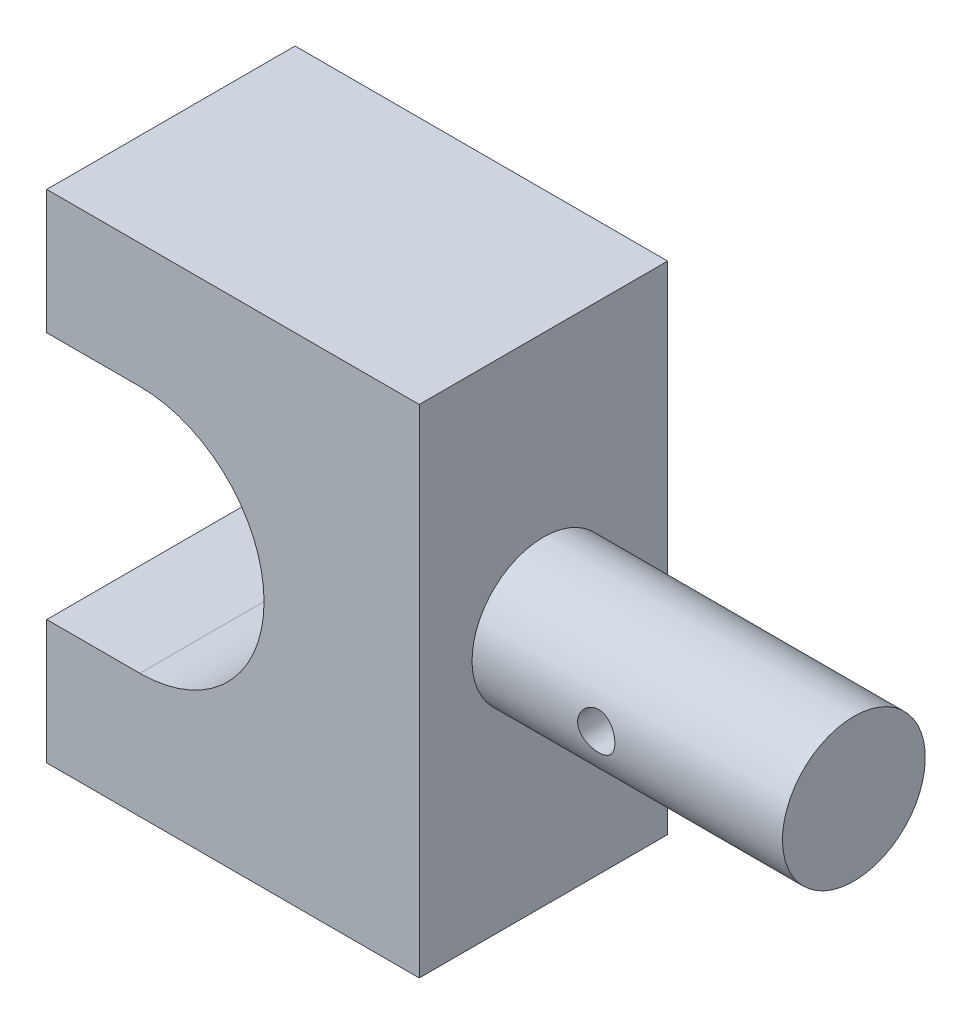
ISO-10303-21;
HEADER;
FILE_DESCRIPTION(('STEP AP214'),'2;1');
FILE_NAME('part.step','',(''),(''),'','','');
FILE_SCHEMA(('AUTOMOTIVE_DESIGN { 1 0 10303 214 1 1 1 1 }'));
ENDSEC;
DATA;
#1=APPLICATION_CONTEXT('core data for automotive mechanical design processes');
#2=APPLICATION_PROTOCOL_DEFINITION('international standard','automotive_design',2000,#1);
#3=PRODUCT_CONTEXT('',#1,'mechanical');
#4=PRODUCT('Part','Part','',(#3));
#5=PRODUCT_RELATED_PRODUCT_CATEGORY('part','',(#4));
#6=PRODUCT_DEFINITION_FORMATION('','',#4);
#7=PRODUCT_DEFINITION_CONTEXT('part definition',#1,'design');
#8=PRODUCT_DEFINITION('design','',#6,#7);
#9=PRODUCT_DEFINITION_SHAPE('','',#8);
#10=(LENGTH_UNIT() NAMED_UNIT(*) SI_UNIT(.MILLI.,.METRE.));
#11=(NAMED_UNIT(*) PLANE_ANGLE_UNIT() SI_UNIT($,.RADIAN.));
#12=(NAMED_UNIT(*) SI_UNIT($,.STERADIAN.) SOLID_ANGLE_UNIT());
#13=UNCERTAINTY_MEASURE_WITH_UNIT(LENGTH_MEASURE(1.E-05),#10,'distance_accuracy_value','');
#14=(GEOMETRIC_REPRESENTATION_CONTEXT(3) GLOBAL_UNCERTAINTY_ASSIGNED_CONTEXT((#13)) GLOBAL_UNIT_ASSIGNED_CONTEXT((#10,
#11,#12)) REPRESENTATION_CONTEXT('',''));
#15=CARTESIAN_POINT('',(0.,0.,0.));
#16=DIRECTION('',(0.,0.,1.));
#17=DIRECTION('',(1.,0.,0.));
#18=AXIS2_PLACEMENT_3D('',#15,#16,#17);
#19=CARTESIAN_POINT('',(40.,40.,80.));
#20=DIRECTION('',(-1.,0.,0.));
#21=DIRECTION('',(0.,-1.,0.));
#22=AXIS2_PLACEMENT_3D('',#19,#20,#21);
#23=PLANE('',#22);
#24=CARTESIAN_POINT('',(40.,0.,40.));
#25=DIRECTION('',(1.,0.,0.));
#26=DIRECTION('',(0.,1.,0.));
#27=AXIS2_PLACEMENT_3D('',#24,#25,#26);
#28=CIRCLE('',#27,11.5);
#29=CARTESIAN_POINT('',(40.,11.5,40.));
#30=VERTEX_POINT('',#29);
#31=EDGE_CURVE('E46',#30,#30,#28,.T.);
#32=ORIENTED_EDGE('',*,*,#31,.F.);
#33=EDGE_LOOP('',(#32));
#34=FACE_BOUND('',#33,.T.);
#35=DIRECTION('',(0.,0.,-1.));
#36=VECTOR('',#35,1.);
#37=CARTESIAN_POINT('',(40.,40.,80.));
#38=LINE('',#37,#36);
#39=CARTESIAN_POINT('',(40.,40.,60.));
#40=VERTEX_POINT('',#39);
#41=CARTESIAN_POINT('',(40.,40.,20.));
#42=VERTEX_POINT('',#41);
#43=EDGE_CURVE('E118',#40,#42,#38,.T.);
#44=ORIENTED_EDGE('',*,*,#43,.F.);
#45=DIRECTION('',(0.,1.,0.));
#46=VECTOR('',#45,1.);
#47=CARTESIAN_POINT('',(40.,40.,60.));
#48=LINE('',#47,#46);
#49=CARTESIAN_POINT('',(40.,-40.,60.));
#50=VERTEX_POINT('',#49);
#51=EDGE_CURVE('E103',#50,#40,#48,.T.);
#52=ORIENTED_EDGE('',*,*,#51,.F.);
#53=DIRECTION('',(0.,0.,-1.));
#54=VECTOR('',#53,1.);
#55=CARTESIAN_POINT('',(40.,-40.,80.));
#56=LINE('',#55,#54);
#57=CARTESIAN_POINT('',(40.,-40.,20.));
#58=VERTEX_POINT('',#57);
#59=EDGE_CURVE('E116',#50,#58,#56,.T.);
#60=ORIENTED_EDGE('',*,*,#59,.T.);
#61=DIRECTION('',(0.,-1.,0.));
#62=VECTOR('',#61,1.);
#63=CARTESIAN_POINT('',(40.,40.,20.));
#64=LINE('',#63,#62);
#65=EDGE_CURVE('E216',#42,#58,#64,.T.);
#66=ORIENTED_EDGE('',*,*,#65,.F.);
#67=EDGE_LOOP('',(#44,#52,#60,#66));
#68=FACE_BOUND('',#67,.T.);
#69=ADVANCED_FACE('F38',(#34,#68),#23,.F.);
#70=CARTESIAN_POINT('',(-40.,40.,80.));
#71=DIRECTION('',(0.,-1.,0.));
#72=DIRECTION('',(0.,0.,-1.));
#73=AXIS2_PLACEMENT_3D('',#70,#71,#72);
#74=PLANE('',#73);
#75=DIRECTION('',(0.,0.,1.));
#76=VECTOR('',#75,1.);
#77=CARTESIAN_POINT('',(-20.,40.,-97.082439194738));
#78=LINE('',#77,#76);
#79=CARTESIAN_POINT('',(-20.,40.,20.));
#80=VERTEX_POINT('',#79);
#81=CARTESIAN_POINT('',(-20.,40.,60.));
#82=VERTEX_POINT('',#81);
#83=EDGE_CURVE('E142',#80,#82,#78,.T.);
#84=ORIENTED_EDGE('',*,*,#83,.T.);
#85=DIRECTION('',(1.,0.,0.));
#86=VECTOR('',#85,1.);
#87=CARTESIAN_POINT('',(-102.462112512353,40.,60.));
#88=LINE('',#87,#86);
#89=EDGE_CURVE('E110',#82,#40,#88,.T.);
#90=ORIENTED_EDGE('',*,*,#89,.T.);
#91=ORIENTED_EDGE('',*,*,#43,.T.);
#92=DIRECTION('',(1.,0.,0.));
#93=VECTOR('',#92,1.);
#94=CARTESIAN_POINT('',(-102.462112512353,40.,20.));
#95=LINE('',#94,#93);
#96=EDGE_CURVE('E213',#80,#42,#95,.T.);
#97=ORIENTED_EDGE('',*,*,#96,.F.);
#98=EDGE_LOOP('',(#84,#90,#91,#97));
#99=FACE_BOUND('',#98,.T.);
#100=ADVANCED_FACE('F239',(#99),#74,.F.);
#101=CARTESIAN_POINT('',(-40.,-40.,80.));
#102=DIRECTION('',(0.,1.,0.));
#103=DIRECTION('',(0.,0.,1.));
#104=AXIS2_PLACEMENT_3D('',#101,#102,#103);
#105=PLANE('',#104);
#106=ORIENTED_EDGE('',*,*,#59,.F.);
#107=DIRECTION('',(1.,0.,0.));
#108=VECTOR('',#107,1.);
#109=CARTESIAN_POINT('',(-102.462112512353,-40.,60.));
#110=LINE('',#109,#108);
#111=CARTESIAN_POINT('',(-20.,-40.,60.));
#112=VERTEX_POINT('',#111);
#113=EDGE_CURVE('E100',#112,#50,#110,.T.);
#114=ORIENTED_EDGE('',*,*,#113,.F.);
#115=DIRECTION('',(0.,0.,1.));
#116=VECTOR('',#115,1.);
#117=CARTESIAN_POINT('',(-20.,-40.,-97.082439194738));
#118=LINE('',#117,#116);
#119=CARTESIAN_POINT('',(-20.,-40.,20.));
#120=VERTEX_POINT('',#119);
#121=EDGE_CURVE('E165',#120,#112,#118,.T.);
#122=ORIENTED_EDGE('',*,*,#121,.F.);
#123=DIRECTION('',(1.,0.,0.));
#124=VECTOR('',#123,1.);
#125=CARTESIAN_POINT('',(-102.462112512353,-40.,20.));
#126=LINE('',#125,#124);
#127=EDGE_CURVE('E60',#120,#58,#126,.T.);
#128=ORIENTED_EDGE('',*,*,#127,.T.);
#129=EDGE_LOOP('',(#106,#114,#122,#128));
#130=FACE_BOUND('',#129,.T.);
#131=ADVANCED_FACE('F122',(#130),#105,.F.);
#132=CARTESIAN_POINT('',(90.,0.,40.));
#133=DIRECTION('',(-1.,0.,0.));
#134=DIRECTION('',(0.,-1.,0.));
#135=AXIS2_PLACEMENT_3D('',#132,#133,#134);
#136=CYLINDRICAL_SURFACE('',#135,11.5);
#137=CARTESIAN_POINT('',(57.,0.,51.5));
#138=CARTESIAN_POINT('',(56.9999929144793,0.165713333128968,51.4999971992222));
#139=CARTESIAN_POINT('',(57.0142509698502,0.331472557718117,51.4963809947813));
#140=CARTESIAN_POINT('',(57.0698944399306,0.658230083805699,51.4823154193962));
#141=CARTESIAN_POINT('',(57.111319881616,0.819220993562539,51.4718559660283));
#142=CARTESIAN_POINT('',(57.219288275698,1.13156769524236,51.4452647851226));
#143=CARTESIAN_POINT('',(57.2857722008391,1.28294516074985,51.4291463937309));
#144=CARTESIAN_POINT('',(57.4419802024155,1.57262290331336,51.3928984546475));
#145=CARTESIAN_POINT('',(57.5316879621202,1.71093226907441,51.3727717254373));
#146=CARTESIAN_POINT('',(57.6838503411623,1.90790359011585,51.3408363050937));
#147=CARTESIAN_POINT('',(57.7385623805815,1.97278915472501,51.3297012291953));
#148=CARTESIAN_POINT('',(57.8534470266988,2.09752879246329,51.3072710023851));
#149=CARTESIAN_POINT('',(57.9136192354235,2.15738323168262,51.2959758631903));
#150=CARTESIAN_POINT('',(58.0390752212288,2.27155751439029,51.2735718477449));
#151=CARTESIAN_POINT('',(58.1043610069235,2.32587516355051,51.2624630467894));
#152=CARTESIAN_POINT('',(58.239374341812,2.42875735456887,51.2407249411116));
#153=CARTESIAN_POINT('',(58.3091023664475,2.4773212790241,51.2300956879228));
#154=CARTESIAN_POINT('',(58.5210814012213,2.61209812661611,51.1997913600685));
#155=CARTESIAN_POINT('',(58.6689385616445,2.68992019795079,51.1811827279662));
#156=CARTESIAN_POINT('',(58.9757292439294,2.8209413055076,51.148850982134));
#157=CARTESIAN_POINT('',(59.1346634796564,2.87413875309752,51.1351281836217));
#158=CARTESIAN_POINT('',(59.380437975739,2.93447568827117,51.1193197655795));
#159=CARTESIAN_POINT('',(59.4648087078123,2.95143653746282,51.1148190791033));
#160=CARTESIAN_POINT('',(59.6347958733598,2.97802436145124,51.1077256323567));
#161=CARTESIAN_POINT('',(59.7204121885742,2.98765202791272,51.1051326921487));
#162=CARTESIAN_POINT('',(59.8921294874213,2.99923344158313,51.1020103563487));
#163=CARTESIAN_POINT('',(59.978230003277,3.00119363107042,51.1014792284075));
#164=CARTESIAN_POINT('',(60.1502442492344,2.99736359218772,51.1025139099773));
#165=CARTESIAN_POINT('',(60.2361579782265,2.99157331790076,51.1040797319115));
#166=CARTESIAN_POINT('',(60.400898269563,2.97323228508069,51.1090041311363));
#167=CARTESIAN_POINT('',(60.479787593987,2.96120135051556,51.1122247016408));
#168=CARTESIAN_POINT('',(60.6362665262471,2.93094230898328,51.1202435171344));
#169=CARTESIAN_POINT('',(60.7138561800339,2.91271442160016,51.1250417062218));
#170=CARTESIAN_POINT('',(60.9441217385628,2.84902434558115,51.1415901293502));
#171=CARTESIAN_POINT('',(61.0942401550492,2.79456197440644,51.1554924325677));
#172=CARTESIAN_POINT('',(61.3907930238574,2.66022505930118,51.1883055032066));
#173=CARTESIAN_POINT('',(61.5367153013357,2.57926803161123,51.207422493309));
#174=CARTESIAN_POINT('',(61.7437791523997,2.44098081395994,51.2380527047266));
#175=CARTESIAN_POINT('',(61.8108271970714,2.39207956695521,51.2485879393664));
#176=CARTESIAN_POINT('',(61.9405573400578,2.28884719509705,51.2700471135985));
#177=CARTESIAN_POINT('',(62.0032398684304,2.23451660638914,51.2809710147415));
#178=CARTESIAN_POINT('',(62.1248270453535,2.11955039987821,51.3031406877457));
#179=CARTESIAN_POINT('',(62.1836356234699,2.05881346256774,51.3143886057379));
#180=CARTESIAN_POINT('',(62.2957552569316,1.93244617652846,51.3366565467286));
#181=CARTESIAN_POINT('',(62.3490657349511,1.86681531515927,51.3476765456976));
#182=CARTESIAN_POINT('',(62.5004887106698,1.66326842835767,51.3799089106097));
#183=CARTESIAN_POINT('',(62.59007159607,1.51871828327957,51.4002895902969));
#184=CARTESIAN_POINT('',(62.7436181460137,1.21785290441562,51.4363296653326));
#185=CARTESIAN_POINT('',(62.8078048776643,1.06165511559652,51.452029856119));
#186=CARTESIAN_POINT('',(62.9097704276922,0.740379908589795,51.4772673423005));
#187=CARTESIAN_POINT('',(62.947575153143,0.575311373546718,51.4868106830114));
#188=CARTESIAN_POINT('',(62.9829629150233,0.324646273448837,51.4957241737664));
#189=CARTESIAN_POINT('',(62.9912041209985,0.240528524843929,51.4977946948557));
#190=CARTESIAN_POINT('',(63.0003243364469,0.0718496277050011,51.5000839006536));
#191=CARTESIAN_POINT('',(63.0012040056737,-0.012711480414662,51.5003027513123));
#192=CARTESIAN_POINT('',(62.9954870508146,-0.181571414884924,51.4988766722565));
#193=CARTESIAN_POINT('',(62.9888894509719,-0.265870205564404,51.4972314992938));
#194=CARTESIAN_POINT('',(62.9685294450415,-0.433526240747768,51.4921322286005));
#195=CARTESIAN_POINT('',(62.9547664055321,-0.516883401346274,51.4886779709476));
#196=CARTESIAN_POINT('',(62.9050239359966,-0.755485247853325,51.4762168522501));
#197=CARTESIAN_POINT('',(62.8601688206936,-0.908845285206872,51.4650030370089));
#198=CARTESIAN_POINT('',(62.7475861765064,-1.2064768540828,51.4375167430814));
#199=CARTESIAN_POINT('',(62.6798489709007,-1.35074450980406,51.4212421244383));
#200=CARTESIAN_POINT('',(62.5596948994555,-1.56235009539216,51.3936218230312));
#201=CARTESIAN_POINT('',(62.5148287139835,-1.63423224164768,51.3835091939229));
#202=CARTESIAN_POINT('',(62.4192413780282,-1.77390640950211,51.3625803807099));
#203=CARTESIAN_POINT('',(62.3685203714857,-1.84169853159184,51.3517642139046));
#204=CARTESIAN_POINT('',(62.2614840147879,-1.97258334709099,51.3297536750948));
#205=CARTESIAN_POINT('',(62.2051718766164,-2.03567870265141,51.3185595226464));
#206=CARTESIAN_POINT('',(62.087183755241,-2.15662889662651,51.2961382869932));
#207=CARTESIAN_POINT('',(62.0255078541784,-2.21448381526615,51.2849112042952));
#208=CARTESIAN_POINT('',(61.8982816902622,-2.32390544438017,51.2628830020077));
#209=CARTESIAN_POINT('',(61.8327986004847,-2.37554955076055,51.252078102917));
#210=CARTESIAN_POINT('',(61.6977096555964,-2.47322461123382,51.2310130797735));
#211=CARTESIAN_POINT('',(61.6281036029794,-2.51925529609816,51.2207529818635));
#212=CARTESIAN_POINT('',(61.4137052932345,-2.64865751785994,51.1911782357856));
#213=CARTESIAN_POINT('',(61.2633604372418,-2.72331567588367,51.1730740690097));
#214=CARTESIAN_POINT('',(60.9491185679907,-2.84842790429457,51.141846425413));
#215=CARTESIAN_POINT('',(60.7850228008848,-2.89841035130229,51.1288209304623));
#216=CARTESIAN_POINT('',(60.534278109258,-2.95204850042458,51.114662233821));
#217=CARTESIAN_POINT('',(60.4499474296063,-2.96637121364495,51.1108394914939));
#218=CARTESIAN_POINT('',(60.2802861348018,-2.98770046788176,51.1051239224715));
#219=CARTESIAN_POINT('',(60.1949556551653,-2.99470798908388,51.1032308372163));
#220=CARTESIAN_POINT('',(60.0269868218564,-3.00104003652828,51.1015210329266));
#221=CARTESIAN_POINT('',(59.9443590718371,-3.00062553553773,51.1016337838505));
#222=CARTESIAN_POINT('',(59.7794853786541,-2.99274114356311,51.1037609631931));
#223=CARTESIAN_POINT('',(59.6972394490431,-2.9852710040331,51.1057754586036));
#224=CARTESIAN_POINT('',(59.4518519256034,-2.95261742765216,51.114523344278));
#225=CARTESIAN_POINT('',(59.2900584542564,-2.91719090410076,51.123961116298));
#226=CARTESIAN_POINT('',(58.9784538168231,-2.82213191523206,51.1484473099376));
#227=CARTESIAN_POINT('',(58.8284526178711,-2.76307508995207,51.163361655957));
#228=CARTESIAN_POINT('',(58.5398719043132,-2.6225990054014,51.1971954601784));
#229=CARTESIAN_POINT('',(58.4012879733114,-2.54118844624223,51.2161133595351));
#230=CARTESIAN_POINT('',(58.1304723826549,-2.35150392374294,51.257462209318));
#231=CARTESIAN_POINT('',(57.9992364408073,-2.2418296026635,51.2800414630129));
#232=CARTESIAN_POINT('',(57.7582528028028,-2.00094095084222,51.3252432724335));
#233=CARTESIAN_POINT('',(57.6485104771882,-1.86972125164303,51.347865837559));
#234=CARTESIAN_POINT('',(57.4550671429421,-1.59386335718055,51.3898471508194));
#235=CARTESIAN_POINT('',(57.3707893385937,-1.44963716422021,51.4092727683711));
#236=CARTESIAN_POINT('',(57.2265742411419,-1.14896312037367,51.4434574096762));
#237=CARTESIAN_POINT('',(57.1666305665042,-0.992518486576954,51.4582176566806));
#238=CARTESIAN_POINT('',(57.0805607768055,-0.697230424021503,51.4796418092192));
#239=CARTESIAN_POINT('',(57.050559679167,-0.559572972926765,51.4872229746185));
#240=CARTESIAN_POINT('',(57.010289846761,-0.281286464540082,51.4974013520081));
#241=CARTESIAN_POINT('',(57.0000060142878,-0.14065976432141,51.5000023773388));
#242=CARTESIAN_POINT('',(57.,0.,51.5));
#243=B_SPLINE_CURVE_WITH_KNOTS('',3,(#137,#138,#139,#140,#141,#142,#143,#144,#145,#146,#147,
#148,#149,#150,#151,#152,#153,#154,#155,#156,#157,#158,#159,#160,#161,#162,#163,#164,#165,#166,
#167,#168,#169,#170,#171,#172,#173,#174,#175,#176,#177,#178,#179,#180,#181,#182,#183,#184,#185,
#186,#187,#188,#189,#190,#191,#192,#193,#194,#195,#196,#197,#198,#199,#200,#201,#202,#203,#204,
#205,#206,#207,#208,#209,#210,#211,#212,#213,#214,#215,#216,#217,#218,#219,#220,#221,#222,#223,
#224,#225,#226,#227,#228,#229,#230,#231,#232,#233,#234,#235,#236,#237,#238,#239,#240,#241,#242),
.UNSPECIFIED.,.T.,.F.,(4,2,2,2,2,2,2,2,2,2,2,2,2,2,2,2,2,2,2,2,2,2,2,2,2,2,2,2,2,2,2,2,2,2,2,2,
2,2,2,2,2,2,2,2,2,2,2,2,2,2,2,2,4),(0.,0.496628918127324,0.993991191605451,1.49018913725256,
1.98603940307557,2.24257761749889,2.49909714871181,2.75571795109679,3.01236626526107,
3.51436560564278,4.01639732748198,4.27463939273603,4.53285709761932,4.79085779916334,
5.04886002921755,5.28818243333232,5.52749635813371,6.00628570661701,6.50777701576575,
6.75849551256317,7.00918927541989,7.26471368871896,7.52026490599828,8.03145476240578,
8.53804922620577,9.04414551262179,9.29750344035905,9.55083866147218,9.80420694572753,
10.0575976314312,10.5359659088463,11.0145367395988,11.270289686137,11.5260363463314,
11.7816369264774,12.0372335930161,12.2892134778632,12.5412054433135,13.045297766233,
13.5586839381991,13.8152720496305,14.0718257755957,14.3193768568024,14.5669366587092,
15.062049916396,15.5457724503201,16.0293069848104,16.5442177153237,17.0592569412813,
17.5615615113178,18.0637342686327,18.4856029069859,18.9071483871231),.UNSPECIFIED.);
#244=CARTESIAN_POINT('',(57.,0.,51.5));
#245=VERTEX_POINT('',#244);
#246=EDGE_CURVE('E130',#245,#245,#243,.T.);
#247=ORIENTED_EDGE('',*,*,#246,.T.);
#248=EDGE_LOOP('',(#247));
#249=FACE_BOUND('',#248,.T.);
#250=CARTESIAN_POINT('',(57.,0.,28.5));
#251=CARTESIAN_POINT('',(57.0000162255294,-0.165754073452058,28.5000029905337));
#252=CARTESIAN_POINT('',(57.0143075846653,-0.331554862507899,28.503621030127));
#253=CARTESIAN_POINT('',(57.0700504591968,-0.658380472888332,28.5176925788846));
#254=CARTESIAN_POINT('',(57.1115422436329,-0.81939784254306,28.5281562226197));
#255=CARTESIAN_POINT('',(57.2196007281781,-1.13178842143938,28.5547568725017));
#256=CARTESIAN_POINT('',(57.2861063414014,-1.28318408358677,28.5708800510099));
#257=CARTESIAN_POINT('',(57.4423322528767,-1.57291433643446,28.607141466699));
#258=CARTESIAN_POINT('',(57.532036226078,-1.71125801895521,28.6272768781309));
#259=CARTESIAN_POINT('',(57.6842522655622,-1.90833479804884,28.6592358094089));
#260=CARTESIAN_POINT('',(57.7390199070336,-1.97329008248477,28.670385748677));
#261=CARTESIAN_POINT('',(57.8540432289185,-2.09814388448425,28.6928427178104));
#262=CARTESIAN_POINT('',(57.9142986231201,-2.15804266545444,28.704149739457));
#263=CARTESIAN_POINT('',(58.0399002016574,-2.2723254959516,28.7265827057121));
#264=CARTESIAN_POINT('',(58.1052483911291,-2.32670735376033,28.7377085768926));
#265=CARTESIAN_POINT('',(58.2403905690281,-2.4297134912781,28.7594813597649));
#266=CARTESIAN_POINT('',(58.3101849683091,-2.47833723771615,28.7701282270386));
#267=CARTESIAN_POINT('',(58.5223893094912,-2.61326823842172,28.8004807826966));
#268=CARTESIAN_POINT('',(58.6704267870113,-2.69115710898416,28.8191151627655));
#269=CARTESIAN_POINT('',(58.9776311605222,-2.82213937039328,28.8514521993188));
#270=CARTESIAN_POINT('',(59.1367981627746,-2.87523252446055,28.8651548087083));
#271=CARTESIAN_POINT('',(59.3825331624395,-2.93520908400058,28.8808741901693));
#272=CARTESIAN_POINT('',(59.4666268965061,-2.95199917227527,28.8853304992442));
#273=CARTESIAN_POINT('',(59.6360415404863,-2.97829748981403,28.8923478060807));
#274=CARTESIAN_POINT('',(59.7213623566882,-2.98780627217069,28.8949089477999));
#275=CARTESIAN_POINT('',(59.8924885081769,-2.99924264462371,28.8979920686397));
#276=CARTESIAN_POINT('',(59.9782934265862,-3.00117598306772,28.8985155939287));
#277=CARTESIAN_POINT('',(60.1496998865873,-2.99740914222685,28.8974988060107));
#278=CARTESIAN_POINT('',(60.235301428451,-2.99170897315605,28.8959584955652));
#279=CARTESIAN_POINT('',(60.4794880180784,-2.96474624524419,28.8887140861902));
#280=CARTESIAN_POINT('',(60.6370769884902,-2.93428135120617,28.8805592637332));
#281=CARTESIAN_POINT('',(60.9451734045263,-2.84917637092648,28.8584520633358));
#282=CARTESIAN_POINT('',(61.0956731168947,-2.79451053140825,28.8444935103588));
#283=CARTESIAN_POINT('',(61.3921370639352,-2.65991117419407,28.811619380734));
#284=CARTESIAN_POINT('',(61.5376520270664,-2.57902094519315,28.792521715332));
#285=CARTESIAN_POINT('',(61.7441209818792,-2.44092589844949,28.7619356616197));
#286=CARTESIAN_POINT('',(61.8109745650357,-2.39210295326959,28.7514174569813));
#287=CARTESIAN_POINT('',(61.9403499426965,-2.28906827541998,28.7299983084278));
#288=CARTESIAN_POINT('',(62.0028721351763,-2.2348570389528,28.7190973998151));
#289=CARTESIAN_POINT('',(62.1243512427709,-2.12001753199752,28.6969465932487));
#290=CARTESIAN_POINT('',(62.1831985198256,-2.05927372629337,28.6856943132508));
#291=CARTESIAN_POINT('',(62.2953597629057,-1.93283565855494,28.6634102812687));
#292=CARTESIAN_POINT('',(62.348673220286,-1.86714094241039,28.6523785496314));
#293=CARTESIAN_POINT('',(62.4496210952074,-1.73132654776234,28.6308648219391));
#294=CARTESIAN_POINT('',(62.4972494800281,-1.66120228737051,28.6203834163523));
#295=CARTESIAN_POINT('',(62.586517745835,-1.51716182966129,28.6002838115892));
#296=CARTESIAN_POINT('',(62.6281576502461,-1.44324564717813,28.5906656090364));
#297=CARTESIAN_POINT('',(62.7429926604786,-1.21804827083572,28.5637018089718));
#298=CARTESIAN_POINT('',(62.8072234085798,-1.0618002961458,28.5479979077506));
#299=CARTESIAN_POINT('',(62.8837750590714,-0.821121724512729,28.5290671086839));
#300=CARTESIAN_POINT('',(62.905992743727,-0.739847540097297,28.523527803245));
#301=CARTESIAN_POINT('',(62.9436156315922,-0.575608855264775,28.5141209566829));
#302=CARTESIAN_POINT('',(62.9590208996933,-0.492644370956467,28.5102533996356));
#303=CARTESIAN_POINT('',(62.9827830119087,-0.325340970563744,28.5042968524369));
#304=CARTESIAN_POINT('',(62.9911140008078,-0.240998151349332,28.5022143862102));
#305=CARTESIAN_POINT('',(63.0003241959251,-0.0718809289747228,28.4999138278724));
#306=CARTESIAN_POINT('',(63.0012039058021,0.0128934446275704,28.49969560975));
#307=CARTESIAN_POINT('',(62.9954887560166,0.182184280394164,28.5011316946812));
#308=CARTESIAN_POINT('',(62.9888929528742,0.266700708653341,28.5027862340944));
#309=CARTESIAN_POINT('',(62.9685122303404,0.434788508688276,28.5079138009123));
#310=CARTESIAN_POINT('',(62.9547267653348,0.518359808247593,28.5113869663303));
#311=CARTESIAN_POINT('',(62.9049360865995,0.757192470264741,28.5238954694079));
#312=CARTESIAN_POINT('',(62.8600599148612,0.910571415714249,28.5351340268449));
#313=CARTESIAN_POINT('',(62.7473388558912,1.20819243031867,28.5626643367342));
#314=CARTESIAN_POINT('',(62.6794846014946,1.35243074472301,28.5789581497669));
#315=CARTESIAN_POINT('',(62.5592392810578,1.56371306472511,28.6065668715403));
#316=CARTESIAN_POINT('',(62.5144375308461,1.63533518115356,28.6166507859576));
#317=CARTESIAN_POINT('',(62.4190114691676,1.77450648056477,28.6375148735907));
#318=CARTESIAN_POINT('',(62.3683871717624,1.84205567338307,28.648295045125));
#319=CARTESIAN_POINT('',(62.261603996917,1.97249446382573,28.6702321797251));
#320=CARTESIAN_POINT('',(62.2054484665915,2.03538683955163,28.681388912268));
#321=CARTESIAN_POINT('',(62.0878251908029,2.15598056795153,28.7037390059503));
#322=CARTESIAN_POINT('',(62.0263576700477,2.2136821399965,28.7149323655211));
#323=CARTESIAN_POINT('',(61.8993298794934,2.32298352719577,28.7369265811336));
#324=CARTESIAN_POINT('',(61.8338210910096,2.37464260954829,28.747730373675));
#325=CARTESIAN_POINT('',(61.698675547227,2.47234092499909,28.7687923459101));
#326=CARTESIAN_POINT('',(61.6290385052171,2.51837976708548,28.7790504876139));
#327=CARTESIAN_POINT('',(61.4145380050136,2.64781692857099,28.8086225769754));
#328=CARTESIAN_POINT('',(61.2641251714698,2.72250171601528,28.8267270324844));
#329=CARTESIAN_POINT('',(60.9497387007896,2.8477685382896,28.857984655664));
#330=CARTESIAN_POINT('',(60.7855642531156,2.89787434025693,28.8710390299374));
#331=CARTESIAN_POINT('',(60.5347002798635,2.95172027659317,28.8852504648699));
#332=CARTESIAN_POINT('',(60.4503359570781,2.9661157532646,28.8890922669071));
#333=CARTESIAN_POINT('',(60.2805997073521,2.98757776063612,28.8948429703267));
#334=CARTESIAN_POINT('',(60.1952279417215,2.99464544896766,28.896752177016));
#335=CARTESIAN_POINT('',(60.0271230364151,3.00104497442076,28.898480395409));
#336=CARTESIAN_POINT('',(59.9444003423131,3.00063498357763,28.8983691646668));
#337=CARTESIAN_POINT('',(59.7793223943127,2.99268930286926,28.8962246460657));
#338=CARTESIAN_POINT('',(59.6969671595885,2.98515324543196,28.8941912590595));
#339=CARTESIAN_POINT('',(59.5331570599717,2.9632412261845,28.8883245626679));
#340=CARTESIAN_POINT('',(59.451703163324,2.94885852489153,28.884489479835));
#341=CARTESIAN_POINT('',(59.2903527011704,2.91351197835741,28.8751730208243));
#342=CARTESIAN_POINT('',(59.2104561622342,2.89254802093911,28.8696916165852));
#343=CARTESIAN_POINT('',(58.9780608826291,2.82145775984149,28.851378076975));
#344=CARTESIAN_POINT('',(58.8283363635286,2.76249887419234,28.8364958254038));
#345=CARTESIAN_POINT('',(58.540264149776,2.6223558112211,28.8027497140479));
#346=CARTESIAN_POINT('',(58.4019111059446,2.5411821625064,28.7838877414051));
#347=CARTESIAN_POINT('',(58.2009322805375,2.40071019282498,28.7532628274926));
#348=CARTESIAN_POINT('',(58.1329659582453,2.34874828222913,28.7422688285985));
#349=CARTESIAN_POINT('',(58.0018703281544,2.23908154805225,28.7199447350257));
#350=CARTESIAN_POINT('',(57.9387407609047,2.18137703289585,28.70861465842));
#351=CARTESIAN_POINT('',(57.8178883194074,2.06053327744515,28.6859391634167));
#352=CARTESIAN_POINT('',(57.7601668740968,1.99739260921653,28.6745937417634));
#353=CARTESIAN_POINT('',(57.6503905315785,1.86632979265173,28.6522580603014));
#354=CARTESIAN_POINT('',(57.5983360970541,1.79840725464396,28.6412678295438));
#355=CARTESIAN_POINT('',(57.4539276172387,1.59227871445022,28.6099382507669));
#356=CARTESIAN_POINT('',(57.3697400683181,1.44807531678396,28.5905320838975));
#357=CARTESIAN_POINT('',(57.2257671332143,1.14754776669376,28.5563993953921));
#358=CARTESIAN_POINT('',(57.1659746148634,0.991227172799148,28.541671506287));
#359=CARTESIAN_POINT('',(57.0801914248338,0.696242076137919,28.5203010153941));
#360=CARTESIAN_POINT('',(57.050317351793,0.558767236791586,28.5127404695729));
#361=CARTESIAN_POINT('',(57.0102221763338,0.280871243632093,28.5025905695429));
#362=CARTESIAN_POINT('',(56.9999862512312,0.14045239292715,28.499997465959));
#363=CARTESIAN_POINT('',(57.,0.,28.5));
#364=B_SPLINE_CURVE_WITH_KNOTS('',3,(#250,#251,#252,#253,#254,#255,#256,#257,#258,#259,#260,
#261,#262,#263,#264,#265,#266,#267,#268,#269,#270,#271,#272,#273,#274,#275,#276,#277,#278,#279,
#280,#281,#282,#283,#284,#285,#286,#287,#288,#289,#290,#291,#292,#293,#294,#295,#296,#297,#298,
#299,#300,#301,#302,#303,#304,#305,#306,#307,#308,#309,#310,#311,#312,#313,#314,#315,#316,#317,
#318,#319,#320,#321,#322,#323,#324,#325,#326,#327,#328,#329,#330,#331,#332,#333,#334,#335,#336,
#337,#338,#339,#340,#341,#342,#343,#344,#345,#346,#347,#348,#349,#350,#351,#352,#353,#354,#355,
#356,#357,#358,#359,#360,#361,#362,#363),.UNSPECIFIED.,.T.,.F.,(4,2,2,2,2,2,2,2,2,2,2,2,2,2,2,2,
2,2,2,2,2,2,2,2,2,2,2,2,2,2,2,2,2,2,2,2,2,2,2,2,2,2,2,2,2,2,2,2,2,2,2,2,2,2,2,2,4),(0.,
0.496753321842966,0.994243731128318,1.49052701332947,1.98646199904112,2.24326818810911,
2.50006099119754,2.75695541459249,3.0138736109531,3.51642802319277,4.01898723433037,
4.27631023757129,4.53361369245519,4.7907218641994,5.0478296919181,5.52760110723156,
6.00788429995658,6.50815140913893,6.75826729108992,7.00836016141414,7.26399228767718,
7.51964788978225,7.77557241370139,8.0314959365047,8.53769954466642,8.79078271763065,
9.04386347980574,9.29786527351704,9.55184989819597,9.80586658168602,10.0599025449809,
10.5383363114772,11.0169653498712,11.2719512177641,11.5269364698768,11.7817683598062,
12.0365894751018,12.2886533497852,12.540734751099,13.0450548759627,13.558794439712,
13.8155217598744,14.0722085165118,14.3200502928763,14.5679048539486,14.8160038963487,
15.064107167813,15.5467746133446,16.0292136953571,16.287709006309,16.5461904414424,
16.8047399812114,17.0633106144632,17.5651747672809,18.0668920890174,18.4881361267647,
18.909062088307),.UNSPECIFIED.);
#365=CARTESIAN_POINT('',(57.,0.,28.5));
#366=VERTEX_POINT('',#365);
#367=EDGE_CURVE('E134',#366,#366,#364,.T.);
#368=ORIENTED_EDGE('',*,*,#367,.T.);
#369=EDGE_LOOP('',(#368));
#370=FACE_BOUND('',#369,.T.);
#371=CARTESIAN_POINT('',(90.,0.,40.));
#372=DIRECTION('',(1.,0.,0.));
#373=DIRECTION('',(0.,1.,0.));
#374=AXIS2_PLACEMENT_3D('',#371,#372,#373);
#375=CIRCLE('',#374,11.5);
#376=CARTESIAN_POINT('',(90.,11.5,40.));
#377=VERTEX_POINT('',#376);
#378=EDGE_CURVE('E124',#377,#377,#375,.T.);
#379=ORIENTED_EDGE('',*,*,#378,.F.);
#380=EDGE_LOOP('',(#379));
#381=FACE_BOUND('',#380,.T.);
#382=ORIENTED_EDGE('',*,*,#31,.T.);
#383=EDGE_LOOP('',(#382));
#384=FACE_BOUND('',#383,.T.);
#385=ADVANCED_FACE('F146',(#249,#370,#381,#384),#136,.T.);
#386=CARTESIAN_POINT('',(90.,0.,40.));
#387=DIRECTION('',(1.,0.,0.));
#388=DIRECTION('',(0.,1.,0.));
#389=AXIS2_PLACEMENT_3D('',#386,#387,#388);
#390=PLANE('',#389);
#391=ORIENTED_EDGE('',*,*,#378,.T.);
#392=EDGE_LOOP('',(#391));
#393=FACE_BOUND('',#392,.T.);
#394=ADVANCED_FACE('F156',(#393),#390,.T.);
#395=CARTESIAN_POINT('',(57.,0.,28.5));
#396=CARTESIAN_POINT('',(57.,0.796472940200126,28.5));
#397=CARTESIAN_POINT('',(57.3281737990931,1.57104802581851,28.5940457984903));
#398=CARTESIAN_POINT('',(58.4300853543591,2.67249231106152,28.8008139584306));
#399=CARTESIAN_POINT('',(59.2116718615348,2.99949636241381,28.898062248266));
#400=CARTESIAN_POINT('',(60.7844902604565,3.00050241014378,28.8983341088721));
#401=CARTESIAN_POINT('',(61.5657405124873,2.67681621470688,28.8016109395382));
#402=CARTESIAN_POINT('',(62.6765795154161,1.56614510739471,28.5931401297565));
#403=CARTESIAN_POINT('',(62.9996657544303,0.786423132833246,28.5000871944891));
#404=CARTESIAN_POINT('',(63.0003337027634,-0.783870942323289,28.4999129471126));
#405=CARTESIAN_POINT('',(62.6756911016237,-1.56620623162942,28.5932320398616));
#406=CARTESIAN_POINT('',(61.5697948463676,-2.67358728520704,28.8009246683124));
#407=CARTESIAN_POINT('',(60.792926630363,-2.9996197710325,28.8980955965168));
#408=CARTESIAN_POINT('',(59.2099531402547,-3.00037953787758,28.898300905558));
#409=CARTESIAN_POINT('',(58.4309162350151,-2.67284183340466,28.8009262623862));
#410=CARTESIAN_POINT('',(57.329196068976,-1.57255005960502,28.5942811556243));
#411=CARTESIAN_POINT('',(57.,-0.796472940200131,28.5));
#412=CARTESIAN_POINT('',(57.,0.,28.5));
#413=B_SPLINE_CURVE_WITH_KNOTS('',3,(#395,#396,#397,#398,#399,#400,#401,#402,#403,#404,#405,
#406,#407,#408,#409,#410,#411,#412),.UNSPECIFIED.,.T.,.F.,(4,2,2,2,2,2,2,2,4),(0.,0.125,
0.249999999999999,0.374999999999999,0.499999999999999,0.624999999999999,0.749999999999999,0.875,
1.),.UNSPECIFIED.);
#414=DIRECTION('',(0.,0.,-1.));
#415=VECTOR('',#414,1.);
#416=SURFACE_OF_LINEAR_EXTRUSION('',#413,#415);
#417=ORIENTED_EDGE('',*,*,#367,.F.);
#418=EDGE_LOOP('',(#417));
#419=FACE_BOUND('',#418,.T.);
#420=ORIENTED_EDGE('',*,*,#246,.F.);
#421=EDGE_LOOP('',(#420));
#422=FACE_BOUND('',#421,.T.);
#423=ADVANCED_FACE('F150',(#419,#422),#416,.F.);
#424=CARTESIAN_POINT('',(-20.,40.,-97.082439194738));
#425=DIRECTION('',(1.,0.,0.));
#426=DIRECTION('',(0.,1.,0.));
#427=AXIS2_PLACEMENT_3D('',#424,#425,#426);
#428=PLANE('',#427);
#429=DIRECTION('',(0.,0.,1.));
#430=VECTOR('',#429,1.);
#431=CARTESIAN_POINT('',(-20.,20.,-97.082439194738));
#432=LINE('',#431,#430);
#433=CARTESIAN_POINT('',(-20.,20.,20.));
#434=VERTEX_POINT('',#433);
#435=CARTESIAN_POINT('',(-20.,20.,60.));
#436=VERTEX_POINT('',#435);
#437=EDGE_CURVE('E184',#434,#436,#432,.T.);
#438=ORIENTED_EDGE('',*,*,#437,.T.);
#439=DIRECTION('',(0.,-1.,0.));
#440=VECTOR('',#439,1.);
#441=CARTESIAN_POINT('',(-20.,40.,60.));
#442=LINE('',#441,#440);
#443=EDGE_CURVE('E212',#82,#436,#442,.T.);
#444=ORIENTED_EDGE('',*,*,#443,.F.);
#445=ORIENTED_EDGE('',*,*,#83,.F.);
#446=DIRECTION('',(0.,1.,0.));
#447=VECTOR('',#446,1.);
#448=CARTESIAN_POINT('',(-20.,40.,20.));
#449=LINE('',#448,#447);
#450=EDGE_CURVE('E219',#434,#80,#449,.T.);
#451=ORIENTED_EDGE('',*,*,#450,.F.);
#452=EDGE_LOOP('',(#438,#444,#445,#451));
#453=FACE_BOUND('',#452,.T.);
#454=ADVANCED_FACE('F155',(#453),#428,.F.);
#455=CARTESIAN_POINT('',(-20.,20.,-97.082439194738));
#456=DIRECTION('',(0.,1.,0.));
#457=DIRECTION('',(0.,0.,1.));
#458=AXIS2_PLACEMENT_3D('',#455,#456,#457);
#459=PLANE('',#458);
#460=DIRECTION('',(0.,0.,1.));
#461=VECTOR('',#460,1.);
#462=CARTESIAN_POINT('',(-5.,20.,-97.082439194738));
#463=LINE('',#462,#461);
#464=CARTESIAN_POINT('',(-5.,20.,20.));
#465=VERTEX_POINT('',#464);
#466=CARTESIAN_POINT('',(-5.,20.,60.));
#467=VERTEX_POINT('',#466);
#468=EDGE_CURVE('E180',#465,#467,#463,.T.);
#469=ORIENTED_EDGE('',*,*,#468,.T.);
#470=DIRECTION('',(-1.,0.,0.));
#471=VECTOR('',#470,1.);
#472=CARTESIAN_POINT('',(-20.,20.,60.));
#473=LINE('',#472,#471);
#474=EDGE_CURVE('E172',#467,#436,#473,.T.);
#475=ORIENTED_EDGE('',*,*,#474,.T.);
#476=ORIENTED_EDGE('',*,*,#437,.F.);
#477=DIRECTION('',(1.,0.,0.));
#478=VECTOR('',#477,1.);
#479=CARTESIAN_POINT('',(-20.,20.,20.));
#480=LINE('',#479,#478);
#481=EDGE_CURVE('E200',#434,#465,#480,.T.);
#482=ORIENTED_EDGE('',*,*,#481,.T.);
#483=EDGE_LOOP('',(#469,#475,#476,#482));
#484=FACE_BOUND('',#483,.T.);
#485=ADVANCED_FACE('F232',(#484),#459,.F.);
#486=CARTESIAN_POINT('',(-5.,0.,-97.082439194738));
#487=DIRECTION('',(0.,0.,1.));
#488=DIRECTION('',(1.,0.,0.));
#489=AXIS2_PLACEMENT_3D('',#486,#487,#488);
#490=CYLINDRICAL_SURFACE('',#489,20.);
#491=DIRECTION('',(0.,0.,1.));
#492=VECTOR('',#491,1.);
#493=CARTESIAN_POINT('',(-5.,-20.,-97.082439194738));
#494=LINE('',#493,#492);
#495=CARTESIAN_POINT('',(-5.,-20.,20.));
#496=VERTEX_POINT('',#495);
#497=CARTESIAN_POINT('',(-5.,-20.,60.));
#498=VERTEX_POINT('',#497);
#499=EDGE_CURVE('E176',#496,#498,#494,.T.);
#500=ORIENTED_EDGE('',*,*,#499,.T.);
#501=CARTESIAN_POINT('',(-5.,0.,60.));
#502=DIRECTION('',(0.,0.,-1.));
#503=DIRECTION('',(-1.,0.,0.));
#504=AXIS2_PLACEMENT_3D('',#501,#502,#503);
#505=CIRCLE('',#504,20.);
#506=EDGE_CURVE('E194',#498,#467,#505,.F.);
#507=ORIENTED_EDGE('',*,*,#506,.T.);
#508=ORIENTED_EDGE('',*,*,#468,.F.);
#509=CARTESIAN_POINT('',(-5.,0.,20.));
#510=DIRECTION('',(0.,0.,1.));
#511=DIRECTION('',(0.,-1.,0.));
#512=AXIS2_PLACEMENT_3D('',#509,#510,#511);
#513=CIRCLE('',#512,20.);
#514=EDGE_CURVE('E204',#465,#496,#513,.F.);
#515=ORIENTED_EDGE('',*,*,#514,.T.);
#516=EDGE_LOOP('',(#500,#507,#508,#515));
#517=FACE_BOUND('',#516,.T.);
#518=ADVANCED_FACE('F288',(#517),#490,.F.);
#519=CARTESIAN_POINT('',(-5.,-20.,-97.082439194738));
#520=DIRECTION('',(0.,-1.,0.));
#521=DIRECTION('',(0.,0.,-1.));
#522=AXIS2_PLACEMENT_3D('',#519,#520,#521);
#523=PLANE('',#522);
#524=DIRECTION('',(0.,0.,1.));
#525=VECTOR('',#524,1.);
#526=CARTESIAN_POINT('',(-20.,-20.,-97.082439194738));
#527=LINE('',#526,#525);
#528=CARTESIAN_POINT('',(-20.,-20.,20.));
#529=VERTEX_POINT('',#528);
#530=CARTESIAN_POINT('',(-20.,-20.,60.));
#531=VERTEX_POINT('',#530);
#532=EDGE_CURVE('E171',#529,#531,#527,.T.);
#533=ORIENTED_EDGE('',*,*,#532,.T.);
#534=DIRECTION('',(1.,0.,0.));
#535=VECTOR('',#534,1.);
#536=CARTESIAN_POINT('',(-5.,-20.,60.));
#537=LINE('',#536,#535);
#538=EDGE_CURVE('E53',#531,#498,#537,.T.);
#539=ORIENTED_EDGE('',*,*,#538,.T.);
#540=ORIENTED_EDGE('',*,*,#499,.F.);
#541=DIRECTION('',(-1.,0.,0.));
#542=VECTOR('',#541,1.);
#543=CARTESIAN_POINT('',(-5.,-20.,20.));
#544=LINE('',#543,#542);
#545=EDGE_CURVE('E208',#496,#529,#544,.T.);
#546=ORIENTED_EDGE('',*,*,#545,.T.);
#547=EDGE_LOOP('',(#533,#539,#540,#546));
#548=FACE_BOUND('',#547,.T.);
#549=ADVANCED_FACE('F297',(#548),#523,.F.);
#550=CARTESIAN_POINT('',(-20.,-20.,-97.082439194738));
#551=DIRECTION('',(1.,0.,0.));
#552=DIRECTION('',(0.,0.,-1.));
#553=AXIS2_PLACEMENT_3D('',#550,#551,#552);
#554=PLANE('',#553);
#555=ORIENTED_EDGE('',*,*,#121,.T.);
#556=DIRECTION('',(0.,1.,0.));
#557=VECTOR('',#556,1.);
#558=CARTESIAN_POINT('',(-20.,-20.,60.));
#559=LINE('',#558,#557);
#560=EDGE_CURVE('E11',#112,#531,#559,.T.);
#561=ORIENTED_EDGE('',*,*,#560,.T.);
#562=ORIENTED_EDGE('',*,*,#532,.F.);
#563=EDGE_CURVE('E120',#120,#529,#449,.T.);
#564=ORIENTED_EDGE('',*,*,#563,.F.);
#565=EDGE_LOOP('',(#555,#561,#562,#564));
#566=FACE_BOUND('',#565,.T.);
#567=ADVANCED_FACE('F158',(#566),#554,.F.);
#568=CARTESIAN_POINT('',(-102.462112512353,40.,20.));
#569=DIRECTION('',(0.,0.,1.));
#570=DIRECTION('',(0.,-1.,0.));
#571=AXIS2_PLACEMENT_3D('',#568,#569,#570);
#572=PLANE('',#571);
#573=ORIENTED_EDGE('',*,*,#450,.T.);
#574=ORIENTED_EDGE('',*,*,#96,.T.);
#575=ORIENTED_EDGE('',*,*,#65,.T.);
#576=ORIENTED_EDGE('',*,*,#127,.F.);
#577=ORIENTED_EDGE('',*,*,#563,.T.);
#578=ORIENTED_EDGE('',*,*,#545,.F.);
#579=ORIENTED_EDGE('',*,*,#514,.F.);
#580=ORIENTED_EDGE('',*,*,#481,.F.);
#581=EDGE_LOOP('',(#573,#574,#575,#576,#577,#578,#579,#580));
#582=FACE_BOUND('',#581,.T.);
#583=ADVANCED_FACE('F237',(#582),#572,.F.);
#584=CARTESIAN_POINT('',(-102.462112512353,40.,60.));
#585=DIRECTION('',(0.,0.,-1.));
#586=DIRECTION('',(-1.,0.,0.));
#587=AXIS2_PLACEMENT_3D('',#584,#585,#586);
#588=PLANE('',#587);
#589=ORIENTED_EDGE('',*,*,#506,.F.);
#590=ORIENTED_EDGE('',*,*,#538,.F.);
#591=ORIENTED_EDGE('',*,*,#560,.F.);
#592=ORIENTED_EDGE('',*,*,#113,.T.);
#593=ORIENTED_EDGE('',*,*,#51,.T.);
#594=ORIENTED_EDGE('',*,*,#89,.F.);
#595=ORIENTED_EDGE('',*,*,#443,.T.);
#596=ORIENTED_EDGE('',*,*,#474,.F.);
#597=EDGE_LOOP('',(#589,#590,#591,#592,#593,#594,#595,#596));
#598=FACE_BOUND('',#597,.T.);
#599=ADVANCED_FACE('F102',(#598),#588,.F.);
#600=CLOSED_SHELL('',(#69,#100,#131,#385,#394,#423,#454,#485,#518,#549,#567,#583,#599));
#601=MANIFOLD_SOLID_BREP('B2',#600);
#602=ADVANCED_BREP_SHAPE_REPRESENTATION('',(#18,#601),#14);
#603=SHAPE_DEFINITION_REPRESENTATION(#9,#602);
ENDSEC;
END-ISO-10303-21;
